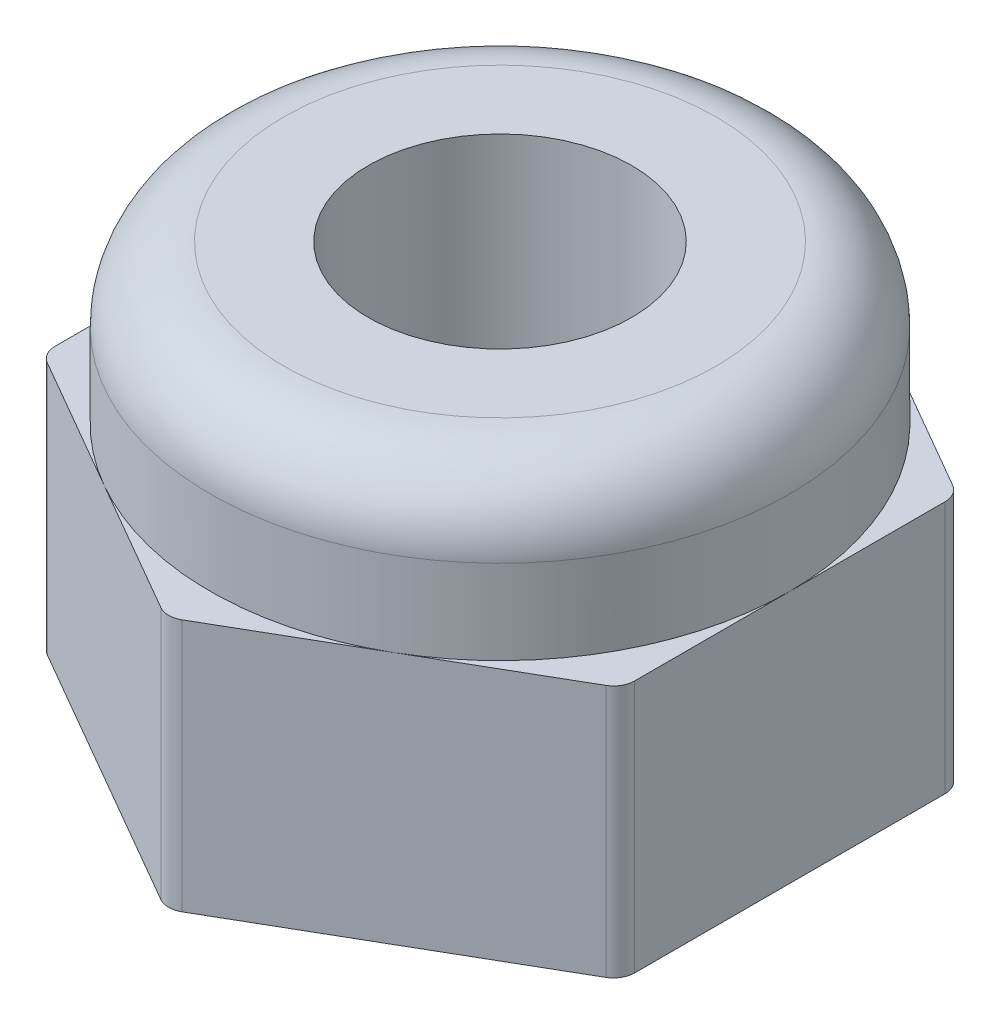
ISO-10303-21;
HEADER;
FILE_DESCRIPTION(('STEP AP214'),'2;1');
FILE_NAME('part.step','',(''),(''),'','','');
FILE_SCHEMA(('AUTOMOTIVE_DESIGN { 1 0 10303 214 1 1 1 1 }'));
ENDSEC;
DATA;
#1=APPLICATION_CONTEXT('core data for automotive mechanical design processes');
#2=APPLICATION_PROTOCOL_DEFINITION('international standard','automotive_design',2000,#1);
#3=PRODUCT_CONTEXT('',#1,'mechanical');
#4=PRODUCT('Part','Part','',(#3));
#5=PRODUCT_RELATED_PRODUCT_CATEGORY('part','',(#4));
#6=PRODUCT_DEFINITION_FORMATION('','',#4);
#7=PRODUCT_DEFINITION_CONTEXT('part definition',#1,'design');
#8=PRODUCT_DEFINITION('design','',#6,#7);
#9=PRODUCT_DEFINITION_SHAPE('','',#8);
#10=(LENGTH_UNIT() NAMED_UNIT(*) SI_UNIT(.MILLI.,.METRE.));
#11=(NAMED_UNIT(*) PLANE_ANGLE_UNIT() SI_UNIT($,.RADIAN.));
#12=(NAMED_UNIT(*) SI_UNIT($,.STERADIAN.) SOLID_ANGLE_UNIT());
#13=UNCERTAINTY_MEASURE_WITH_UNIT(LENGTH_MEASURE(1.E-05),#10,'distance_accuracy_value','');
#14=(GEOMETRIC_REPRESENTATION_CONTEXT(3) GLOBAL_UNCERTAINTY_ASSIGNED_CONTEXT((#13)) GLOBAL_UNIT_ASSIGNED_CONTEXT((#10,
#11,#12)) REPRESENTATION_CONTEXT('',''));
#15=CARTESIAN_POINT('',(0.,0.,0.));
#16=DIRECTION('',(0.,0.,1.));
#17=DIRECTION('',(1.,0.,0.));
#18=AXIS2_PLACEMENT_3D('',#15,#16,#17);
#19=CARTESIAN_POINT('',(0.,2.4,0.));
#20=DIRECTION('',(0.,1.,0.));
#21=DIRECTION('',(0.,0.,1.));
#22=AXIS2_PLACEMENT_3D('',#19,#20,#21);
#23=PLANE('',#22);
#24=DIRECTION('',(0.866025403784439,0.,-0.5));
#25=VECTOR('',#24,1.);
#26=CARTESIAN_POINT('',(0.,2.4,3.17542648054294));
#27=LINE('',#26,#25);
#28=CARTESIAN_POINT('',(1.375,2.4,2.38156986040721));
#29=VERTEX_POINT('',#28);
#30=CARTESIAN_POINT('',(2.65,2.4,1.64544826719043));
#31=VERTEX_POINT('',#30);
#32=EDGE_CURVE('E160',#29,#31,#27,.T.);
#33=ORIENTED_EDGE('',*,*,#32,.T.);
#34=CARTESIAN_POINT('',(2.55,2.4,1.47224318643355));
#35=DIRECTION('',(0.,1.,0.));
#36=DIRECTION('',(0.,0.,1.));
#37=AXIS2_PLACEMENT_3D('',#34,#35,#36);
#38=CIRCLE('',#37,0.2);
#39=CARTESIAN_POINT('',(2.75,2.4,1.47224318643355));
#40=VERTEX_POINT('',#39);
#41=EDGE_CURVE('E53',#31,#40,#38,.T.);
#42=ORIENTED_EDGE('',*,*,#41,.T.);
#43=DIRECTION('',(0.,0.,-1.));
#44=VECTOR('',#43,1.);
#45=CARTESIAN_POINT('',(2.75,2.4,1.58771324027147));
#46=LINE('',#45,#44);
#47=CARTESIAN_POINT('',(2.75,2.4,0.));
#48=VERTEX_POINT('',#47);
#49=EDGE_CURVE('E171',#40,#48,#46,.T.);
#50=ORIENTED_EDGE('',*,*,#49,.T.);
#51=CARTESIAN_POINT('',(0.,2.4,0.));
#52=DIRECTION('',(0.,1.,0.));
#53=DIRECTION('',(0.,0.,1.));
#54=AXIS2_PLACEMENT_3D('',#51,#52,#53);
#55=CIRCLE('',#54,2.75);
#56=EDGE_CURVE('E169',#29,#48,#55,.T.);
#57=ORIENTED_EDGE('',*,*,#56,.F.);
#58=EDGE_LOOP('',(#33,#42,#50,#57));
#59=FACE_BOUND('',#58,.T.);
#60=ADVANCED_FACE('F43',(#59),#23,.T.);
#61=CARTESIAN_POINT('',(2.75,2.4,-1.47224318643355));
#62=VERTEX_POINT('',#61);
#63=EDGE_CURVE('E195',#48,#62,#46,.T.);
#64=ORIENTED_EDGE('',*,*,#63,.T.);
#65=CARTESIAN_POINT('',(2.55,2.4,-1.47224318643355));
#66=DIRECTION('',(0.,1.,0.));
#67=DIRECTION('',(0.,0.,1.));
#68=AXIS2_PLACEMENT_3D('',#65,#66,#67);
#69=CIRCLE('',#68,0.2);
#70=CARTESIAN_POINT('',(2.65,2.4,-1.64544826719043));
#71=VERTEX_POINT('',#70);
#72=EDGE_CURVE('E301',#62,#71,#69,.T.);
#73=ORIENTED_EDGE('',*,*,#72,.T.);
#74=DIRECTION('',(-0.866025403784438,0.,-0.5));
#75=VECTOR('',#74,1.);
#76=CARTESIAN_POINT('',(2.75,2.4,-1.58771324027147));
#77=LINE('',#76,#75);
#78=CARTESIAN_POINT('',(1.375,2.4,-2.38156986040721));
#79=VERTEX_POINT('',#78);
#80=EDGE_CURVE('E196',#71,#79,#77,.T.);
#81=ORIENTED_EDGE('',*,*,#80,.T.);
#82=EDGE_CURVE('E177',#48,#79,#55,.T.);
#83=ORIENTED_EDGE('',*,*,#82,.F.);
#84=EDGE_LOOP('',(#64,#73,#81,#83));
#85=FACE_BOUND('',#84,.T.);
#86=ADVANCED_FACE('F366',(#85),#23,.T.);
#87=CARTESIAN_POINT('',(0.100000000000001,2.4,-3.11769145362398));
#88=VERTEX_POINT('',#87);
#89=EDGE_CURVE('E194',#79,#88,#77,.T.);
#90=ORIENTED_EDGE('',*,*,#89,.T.);
#91=CARTESIAN_POINT('',(0.,2.4,-2.94448637286709));
#92=DIRECTION('',(0.,1.,0.));
#93=DIRECTION('',(0.,0.,1.));
#94=AXIS2_PLACEMENT_3D('',#91,#92,#93);
#95=CIRCLE('',#94,0.2);
#96=CARTESIAN_POINT('',(-0.0999999999999998,2.4,-3.11769145362398));
#97=VERTEX_POINT('',#96);
#98=EDGE_CURVE('E291',#88,#97,#95,.T.);
#99=ORIENTED_EDGE('',*,*,#98,.T.);
#100=DIRECTION('',(-0.866025403784439,0.,0.5));
#101=VECTOR('',#100,1.);
#102=CARTESIAN_POINT('',(0.,2.4,-3.17542648054294));
#103=LINE('',#102,#101);
#104=CARTESIAN_POINT('',(-1.375,2.4,-2.38156986040721));
#105=VERTEX_POINT('',#104);
#106=EDGE_CURVE('E200',#97,#105,#103,.T.);
#107=ORIENTED_EDGE('',*,*,#106,.T.);
#108=EDGE_CURVE('E371',#79,#105,#55,.T.);
#109=ORIENTED_EDGE('',*,*,#108,.F.);
#110=EDGE_LOOP('',(#90,#99,#107,#109));
#111=FACE_BOUND('',#110,.T.);
#112=ADVANCED_FACE('F381',(#111),#23,.T.);
#113=CARTESIAN_POINT('',(-2.65,2.4,-1.64544826719043));
#114=VERTEX_POINT('',#113);
#115=EDGE_CURVE('E199',#105,#114,#103,.T.);
#116=ORIENTED_EDGE('',*,*,#115,.T.);
#117=CARTESIAN_POINT('',(-2.55,2.4,-1.47224318643355));
#118=DIRECTION('',(0.,1.,0.));
#119=DIRECTION('',(0.,0.,1.));
#120=AXIS2_PLACEMENT_3D('',#117,#118,#119);
#121=CIRCLE('',#120,0.2);
#122=CARTESIAN_POINT('',(-2.75,2.4,-1.47224318643355));
#123=VERTEX_POINT('',#122);
#124=EDGE_CURVE('E281',#114,#123,#121,.T.);
#125=ORIENTED_EDGE('',*,*,#124,.T.);
#126=DIRECTION('',(0.,0.,1.));
#127=VECTOR('',#126,1.);
#128=CARTESIAN_POINT('',(-2.75,2.4,-1.58771324027147));
#129=LINE('',#128,#127);
#130=CARTESIAN_POINT('',(-2.75,2.4,0.));
#131=VERTEX_POINT('',#130);
#132=EDGE_CURVE('E204',#123,#131,#129,.T.);
#133=ORIENTED_EDGE('',*,*,#132,.T.);
#134=EDGE_CURVE('E187',#105,#131,#55,.T.);
#135=ORIENTED_EDGE('',*,*,#134,.F.);
#136=EDGE_LOOP('',(#116,#125,#133,#135));
#137=FACE_BOUND('',#136,.T.);
#138=ADVANCED_FACE('F377',(#137),#23,.T.);
#139=CARTESIAN_POINT('',(-2.75,2.4,1.47224318643355));
#140=VERTEX_POINT('',#139);
#141=EDGE_CURVE('E203',#131,#140,#129,.T.);
#142=ORIENTED_EDGE('',*,*,#141,.T.);
#143=CARTESIAN_POINT('',(-2.55,2.4,1.47224318643355));
#144=DIRECTION('',(0.,1.,0.));
#145=DIRECTION('',(0.,0.,1.));
#146=AXIS2_PLACEMENT_3D('',#143,#144,#145);
#147=CIRCLE('',#146,0.2);
#148=CARTESIAN_POINT('',(-2.65,2.4,1.64544826719043));
#149=VERTEX_POINT('',#148);
#150=EDGE_CURVE('E271',#140,#149,#147,.T.);
#151=ORIENTED_EDGE('',*,*,#150,.T.);
#152=DIRECTION('',(0.866025403784439,0.,0.5));
#153=VECTOR('',#152,1.);
#154=CARTESIAN_POINT('',(-2.75,2.4,1.58771324027147));
#155=LINE('',#154,#153);
#156=CARTESIAN_POINT('',(-1.375,2.4,2.38156986040721));
#157=VERTEX_POINT('',#156);
#158=EDGE_CURVE('E167',#149,#157,#155,.T.);
#159=ORIENTED_EDGE('',*,*,#158,.T.);
#160=EDGE_CURVE('E183',#131,#157,#55,.T.);
#161=ORIENTED_EDGE('',*,*,#160,.F.);
#162=EDGE_LOOP('',(#142,#151,#159,#161));
#163=FACE_BOUND('',#162,.T.);
#164=ADVANCED_FACE('F388',(#163),#23,.T.);
#165=CARTESIAN_POINT('',(2.75,2.4,1.58771324027147));
#166=DIRECTION('',(-1.,0.,0.));
#167=DIRECTION('',(0.,0.,1.));
#168=AXIS2_PLACEMENT_3D('',#165,#166,#167);
#169=PLANE('',#168);
#170=DIRECTION('',(0.,0.,-1.));
#171=VECTOR('',#170,1.);
#172=CARTESIAN_POINT('',(2.75,0.,1.58771324027147));
#173=LINE('',#172,#171);
#174=CARTESIAN_POINT('',(2.75,0.,1.47224318643355));
#175=VERTEX_POINT('',#174);
#176=CARTESIAN_POINT('',(2.75,0.,-1.47224318643355));
#177=VERTEX_POINT('',#176);
#178=EDGE_CURVE('E176',#175,#177,#173,.T.);
#179=ORIENTED_EDGE('',*,*,#178,.T.);
#180=DIRECTION('',(0.,-1.,0.));
#181=VECTOR('',#180,1.);
#182=CARTESIAN_POINT('',(2.75,2.4,-1.47224318643355));
#183=LINE('',#182,#181);
#184=EDGE_CURVE('E298',#177,#62,#183,.F.);
#185=ORIENTED_EDGE('',*,*,#184,.T.);
#186=ORIENTED_EDGE('',*,*,#63,.F.);
#187=ORIENTED_EDGE('',*,*,#49,.F.);
#188=DIRECTION('',(0.,-1.,0.));
#189=VECTOR('',#188,1.);
#190=CARTESIAN_POINT('',(2.75,2.4,1.47224318643355));
#191=LINE('',#190,#189);
#192=EDGE_CURVE('E294',#40,#175,#191,.T.);
#193=ORIENTED_EDGE('',*,*,#192,.T.);
#194=EDGE_LOOP('',(#179,#185,#186,#187,#193));
#195=FACE_BOUND('',#194,.T.);
#196=ADVANCED_FACE('F314',(#195),#169,.F.);
#197=CARTESIAN_POINT('',(2.75,2.4,-1.58771324027147));
#198=DIRECTION('',(-0.5,0.,0.866025403784439));
#199=DIRECTION('',(0.866025403784439,0.,0.5));
#200=AXIS2_PLACEMENT_3D('',#197,#198,#199);
#201=PLANE('',#200);
#202=DIRECTION('',(-0.866025403784438,0.,-0.5));
#203=VECTOR('',#202,1.);
#204=CARTESIAN_POINT('',(2.75,0.,-1.58771324027147));
#205=LINE('',#204,#203);
#206=CARTESIAN_POINT('',(2.65,0.,-1.64544826719043));
#207=VERTEX_POINT('',#206);
#208=CARTESIAN_POINT('',(0.100000000000001,0.,-3.11769145362398));
#209=VERTEX_POINT('',#208);
#210=EDGE_CURVE('E213',#207,#209,#205,.T.);
#211=ORIENTED_EDGE('',*,*,#210,.T.);
#212=DIRECTION('',(0.,-1.,0.));
#213=VECTOR('',#212,1.);
#214=CARTESIAN_POINT('',(0.0999999999999998,2.4,-3.11769145362398));
#215=LINE('',#214,#213);
#216=EDGE_CURVE('E288',#209,#88,#215,.F.);
#217=ORIENTED_EDGE('',*,*,#216,.T.);
#218=ORIENTED_EDGE('',*,*,#89,.F.);
#219=ORIENTED_EDGE('',*,*,#80,.F.);
#220=DIRECTION('',(0.,-1.,0.));
#221=VECTOR('',#220,1.);
#222=CARTESIAN_POINT('',(2.65,2.4,-1.64544826719043));
#223=LINE('',#222,#221);
#224=EDGE_CURVE('E284',#71,#207,#223,.T.);
#225=ORIENTED_EDGE('',*,*,#224,.T.);
#226=EDGE_LOOP('',(#211,#217,#218,#219,#225));
#227=FACE_BOUND('',#226,.T.);
#228=ADVANCED_FACE('F356',(#227),#201,.F.);
#229=CARTESIAN_POINT('',(0.,2.4,-3.17542648054294));
#230=DIRECTION('',(0.5,0.,0.866025403784439));
#231=DIRECTION('',(0.866025403784439,0.,-0.5));
#232=AXIS2_PLACEMENT_3D('',#229,#230,#231);
#233=PLANE('',#232);
#234=DIRECTION('',(-0.866025403784439,0.,0.5));
#235=VECTOR('',#234,1.);
#236=CARTESIAN_POINT('',(0.,0.,-3.17542648054294));
#237=LINE('',#236,#235);
#238=CARTESIAN_POINT('',(-0.0999999999999998,0.,-3.11769145362398));
#239=VERTEX_POINT('',#238);
#240=CARTESIAN_POINT('',(-2.65,0.,-1.64544826719043));
#241=VERTEX_POINT('',#240);
#242=EDGE_CURVE('E217',#239,#241,#237,.T.);
#243=ORIENTED_EDGE('',*,*,#242,.T.);
#244=DIRECTION('',(0.,-1.,0.));
#245=VECTOR('',#244,1.);
#246=CARTESIAN_POINT('',(-2.65,2.4,-1.64544826719044));
#247=LINE('',#246,#245);
#248=EDGE_CURVE('E278',#241,#114,#247,.F.);
#249=ORIENTED_EDGE('',*,*,#248,.T.);
#250=ORIENTED_EDGE('',*,*,#115,.F.);
#251=ORIENTED_EDGE('',*,*,#106,.F.);
#252=DIRECTION('',(0.,-1.,0.));
#253=VECTOR('',#252,1.);
#254=CARTESIAN_POINT('',(-0.0999999999999998,2.4,-3.11769145362398));
#255=LINE('',#254,#253);
#256=EDGE_CURVE('E274',#97,#239,#255,.T.);
#257=ORIENTED_EDGE('',*,*,#256,.T.);
#258=EDGE_LOOP('',(#243,#249,#250,#251,#257));
#259=FACE_BOUND('',#258,.T.);
#260=ADVANCED_FACE('F345',(#259),#233,.F.);
#261=CARTESIAN_POINT('',(-2.75,2.4,-1.58771324027147));
#262=DIRECTION('',(1.,0.,0.));
#263=DIRECTION('',(0.,0.,-1.));
#264=AXIS2_PLACEMENT_3D('',#261,#262,#263);
#265=PLANE('',#264);
#266=DIRECTION('',(0.,0.,1.));
#267=VECTOR('',#266,1.);
#268=CARTESIAN_POINT('',(-2.75,0.,-1.58771324027147));
#269=LINE('',#268,#267);
#270=CARTESIAN_POINT('',(-2.75,0.,-1.47224318643355));
#271=VERTEX_POINT('',#270);
#272=CARTESIAN_POINT('',(-2.75,0.,1.47224318643355));
#273=VERTEX_POINT('',#272);
#274=EDGE_CURVE('E221',#271,#273,#269,.T.);
#275=ORIENTED_EDGE('',*,*,#274,.T.);
#276=DIRECTION('',(0.,-1.,0.));
#277=VECTOR('',#276,1.);
#278=CARTESIAN_POINT('',(-2.75,2.4,1.47224318643355));
#279=LINE('',#278,#277);
#280=EDGE_CURVE('E268',#273,#140,#279,.F.);
#281=ORIENTED_EDGE('',*,*,#280,.T.);
#282=ORIENTED_EDGE('',*,*,#141,.F.);
#283=ORIENTED_EDGE('',*,*,#132,.F.);
#284=DIRECTION('',(0.,-1.,0.));
#285=VECTOR('',#284,1.);
#286=CARTESIAN_POINT('',(-2.75,2.4,-1.47224318643355));
#287=LINE('',#286,#285);
#288=EDGE_CURVE('E264',#123,#271,#287,.T.);
#289=ORIENTED_EDGE('',*,*,#288,.T.);
#290=EDGE_LOOP('',(#275,#281,#282,#283,#289));
#291=FACE_BOUND('',#290,.T.);
#292=ADVANCED_FACE('F334',(#291),#265,.F.);
#293=CARTESIAN_POINT('',(-2.75,2.4,1.58771324027147));
#294=DIRECTION('',(0.5,0.,-0.866025403784439));
#295=DIRECTION('',(-0.866025403784439,0.,-0.5));
#296=AXIS2_PLACEMENT_3D('',#293,#294,#295);
#297=PLANE('',#296);
#298=ORIENTED_EDGE('',*,*,#158,.F.);
#299=DIRECTION('',(0.,-1.,0.));
#300=VECTOR('',#299,1.);
#301=CARTESIAN_POINT('',(-2.65,2.4,1.64544826719043));
#302=LINE('',#301,#300);
#303=CARTESIAN_POINT('',(-2.65,0.,1.64544826719043));
#304=VERTEX_POINT('',#303);
#305=EDGE_CURVE('E242',#149,#304,#302,.T.);
#306=ORIENTED_EDGE('',*,*,#305,.T.);
#307=DIRECTION('',(0.866025403784439,0.,0.5));
#308=VECTOR('',#307,1.);
#309=CARTESIAN_POINT('',(-2.75,0.,1.58771324027147));
#310=LINE('',#309,#308);
#311=CARTESIAN_POINT('',(-0.099999999999999,0.,3.11769145362398));
#312=VERTEX_POINT('',#311);
#313=EDGE_CURVE('E225',#304,#312,#310,.T.);
#314=ORIENTED_EDGE('',*,*,#313,.T.);
#315=DIRECTION('',(0.,-1.,0.));
#316=VECTOR('',#315,1.);
#317=CARTESIAN_POINT('',(-0.099999999999999,2.4,3.11769145362398));
#318=LINE('',#317,#316);
#319=CARTESIAN_POINT('',(-0.099999999999999,2.4,3.11769145362398));
#320=VERTEX_POINT('',#319);
#321=EDGE_CURVE('E239',#312,#320,#318,.F.);
#322=ORIENTED_EDGE('',*,*,#321,.T.);
#323=EDGE_CURVE('E207',#157,#320,#155,.T.);
#324=ORIENTED_EDGE('',*,*,#323,.F.);
#325=EDGE_LOOP('',(#298,#306,#314,#322,#324));
#326=FACE_BOUND('',#325,.T.);
#327=ADVANCED_FACE('F326',(#326),#297,.F.);
#328=CARTESIAN_POINT('',(0.,2.4,3.17542648054294));
#329=DIRECTION('',(-0.5,0.,-0.866025403784439));
#330=DIRECTION('',(-0.866025403784439,0.,0.5));
#331=AXIS2_PLACEMENT_3D('',#328,#329,#330);
#332=PLANE('',#331);
#333=DIRECTION('',(0.866025403784439,0.,-0.5));
#334=VECTOR('',#333,1.);
#335=CARTESIAN_POINT('',(0.,0.,3.17542648054294));
#336=LINE('',#335,#334);
#337=CARTESIAN_POINT('',(0.100000000000001,0.,3.11769145362398));
#338=VERTEX_POINT('',#337);
#339=CARTESIAN_POINT('',(2.65,0.,1.64544826719043));
#340=VERTEX_POINT('',#339);
#341=EDGE_CURVE('E229',#338,#340,#336,.T.);
#342=ORIENTED_EDGE('',*,*,#341,.T.);
#343=DIRECTION('',(0.,-1.,0.));
#344=VECTOR('',#343,1.);
#345=CARTESIAN_POINT('',(2.65,2.4,1.64544826719043));
#346=LINE('',#345,#344);
#347=EDGE_CURVE('E66',#340,#31,#346,.F.);
#348=ORIENTED_EDGE('',*,*,#347,.T.);
#349=ORIENTED_EDGE('',*,*,#32,.F.);
#350=CARTESIAN_POINT('',(0.100000000000001,2.4,3.11769145362398));
#351=VERTEX_POINT('',#350);
#352=EDGE_CURVE('E151',#351,#29,#27,.T.);
#353=ORIENTED_EDGE('',*,*,#352,.F.);
#354=DIRECTION('',(0.,-1.,0.));
#355=VECTOR('',#354,1.);
#356=CARTESIAN_POINT('',(0.100000000000001,2.4,3.11769145362398));
#357=LINE('',#356,#355);
#358=EDGE_CURVE('E304',#351,#338,#357,.T.);
#359=ORIENTED_EDGE('',*,*,#358,.T.);
#360=EDGE_LOOP('',(#342,#348,#349,#353,#359));
#361=FACE_BOUND('',#360,.T.);
#362=ADVANCED_FACE('F163',(#361),#332,.F.);
#363=ORIENTED_EDGE('',*,*,#323,.T.);
#364=CARTESIAN_POINT('',(0.,2.4,2.94448637286709));
#365=DIRECTION('',(0.,1.,0.));
#366=DIRECTION('',(0.,0.,1.));
#367=AXIS2_PLACEMENT_3D('',#364,#365,#366);
#368=CIRCLE('',#367,0.2);
#369=EDGE_CURVE('E11',#320,#351,#368,.T.);
#370=ORIENTED_EDGE('',*,*,#369,.T.);
#371=ORIENTED_EDGE('',*,*,#352,.T.);
#372=EDGE_CURVE('E154',#157,#29,#55,.T.);
#373=ORIENTED_EDGE('',*,*,#372,.F.);
#374=EDGE_LOOP('',(#363,#370,#371,#373));
#375=FACE_BOUND('',#374,.T.);
#376=ADVANCED_FACE('F152',(#375),#23,.T.);
#377=CARTESIAN_POINT('',(0.,0.,0.));
#378=DIRECTION('',(0.,1.,0.));
#379=DIRECTION('',(0.,0.,1.));
#380=AXIS2_PLACEMENT_3D('',#377,#378,#379);
#381=PLANE('',#380);
#382=CARTESIAN_POINT('',(0.,0.,0.));
#383=DIRECTION('',(0.,-1.,0.));
#384=DIRECTION('',(0.,0.,-1.));
#385=AXIS2_PLACEMENT_3D('',#382,#383,#384);
#386=CIRCLE('',#385,1.25);
#387=CARTESIAN_POINT('',(0.,0.,-1.25));
#388=VERTEX_POINT('',#387);
#389=EDGE_CURVE('E189',#388,#388,#386,.T.);
#390=ORIENTED_EDGE('',*,*,#389,.F.);
#391=EDGE_LOOP('',(#390));
#392=FACE_BOUND('',#391,.T.);
#393=ORIENTED_EDGE('',*,*,#313,.F.);
#394=CARTESIAN_POINT('',(-2.55,0.,1.47224318643355));
#395=DIRECTION('',(0.,1.,0.));
#396=DIRECTION('',(0.,0.,1.));
#397=AXIS2_PLACEMENT_3D('',#394,#395,#396);
#398=CIRCLE('',#397,0.2);
#399=EDGE_CURVE('E261',#304,#273,#398,.F.);
#400=ORIENTED_EDGE('',*,*,#399,.T.);
#401=ORIENTED_EDGE('',*,*,#274,.F.);
#402=CARTESIAN_POINT('',(-2.55,0.,-1.47224318643355));
#403=DIRECTION('',(0.,1.,0.));
#404=DIRECTION('',(0.,0.,1.));
#405=AXIS2_PLACEMENT_3D('',#402,#403,#404);
#406=CIRCLE('',#405,0.2);
#407=EDGE_CURVE('E258',#271,#241,#406,.F.);
#408=ORIENTED_EDGE('',*,*,#407,.T.);
#409=ORIENTED_EDGE('',*,*,#242,.F.);
#410=CARTESIAN_POINT('',(0.,0.,-2.94448637286709));
#411=DIRECTION('',(0.,1.,0.));
#412=DIRECTION('',(0.,0.,1.));
#413=AXIS2_PLACEMENT_3D('',#410,#411,#412);
#414=CIRCLE('',#413,0.2);
#415=EDGE_CURVE('E255',#239,#209,#414,.F.);
#416=ORIENTED_EDGE('',*,*,#415,.T.);
#417=ORIENTED_EDGE('',*,*,#210,.F.);
#418=CARTESIAN_POINT('',(2.55,0.,-1.47224318643355));
#419=DIRECTION('',(0.,1.,0.));
#420=DIRECTION('',(0.,0.,1.));
#421=AXIS2_PLACEMENT_3D('',#418,#419,#420);
#422=CIRCLE('',#421,0.2);
#423=EDGE_CURVE('E252',#207,#177,#422,.F.);
#424=ORIENTED_EDGE('',*,*,#423,.T.);
#425=ORIENTED_EDGE('',*,*,#178,.F.);
#426=CARTESIAN_POINT('',(2.55,0.,1.47224318643355));
#427=DIRECTION('',(0.,1.,0.));
#428=DIRECTION('',(0.,0.,1.));
#429=AXIS2_PLACEMENT_3D('',#426,#427,#428);
#430=CIRCLE('',#429,0.2);
#431=EDGE_CURVE('E249',#175,#340,#430,.F.);
#432=ORIENTED_EDGE('',*,*,#431,.T.);
#433=ORIENTED_EDGE('',*,*,#341,.F.);
#434=CARTESIAN_POINT('',(0.,0.,2.94448637286709));
#435=DIRECTION('',(0.,1.,0.));
#436=DIRECTION('',(0.,0.,1.));
#437=AXIS2_PLACEMENT_3D('',#434,#435,#436);
#438=CIRCLE('',#437,0.2);
#439=EDGE_CURVE('E246',#338,#312,#438,.F.);
#440=ORIENTED_EDGE('',*,*,#439,.T.);
#441=EDGE_LOOP('',(#393,#400,#401,#408,#409,#416,#417,#424,#425,#432,#433,#440));
#442=FACE_BOUND('',#441,.T.);
#443=ADVANCED_FACE('F321',(#392,#442),#381,.F.);
#444=CARTESIAN_POINT('',(0.,3.9,0.));
#445=DIRECTION('',(0.,-1.,0.));
#446=DIRECTION('',(0.,0.,-1.));
#447=AXIS2_PLACEMENT_3D('',#444,#445,#446);
#448=CYLINDRICAL_SURFACE('',#447,2.75);
#449=CARTESIAN_POINT('',(0.,3.2,0.));
#450=DIRECTION('',(0.,-1.,0.));
#451=DIRECTION('',(0.,0.,-1.));
#452=AXIS2_PLACEMENT_3D('',#449,#450,#451);
#453=CIRCLE('',#452,2.75);
#454=CARTESIAN_POINT('',(0.,3.2,-2.75));
#455=VERTEX_POINT('',#454);
#456=EDGE_CURVE('E159',#455,#455,#453,.T.);
#457=ORIENTED_EDGE('',*,*,#456,.T.);
#458=EDGE_LOOP('',(#457));
#459=FACE_BOUND('',#458,.T.);
#460=ORIENTED_EDGE('',*,*,#372,.T.);
#461=ORIENTED_EDGE('',*,*,#56,.T.);
#462=ORIENTED_EDGE('',*,*,#82,.T.);
#463=ORIENTED_EDGE('',*,*,#108,.T.);
#464=ORIENTED_EDGE('',*,*,#134,.T.);
#465=ORIENTED_EDGE('',*,*,#160,.T.);
#466=EDGE_LOOP('',(#460,#461,#462,#463,#464,#465));
#467=FACE_BOUND('',#466,.T.);
#468=ADVANCED_FACE('F180',(#459,#467),#448,.T.);
#469=CARTESIAN_POINT('',(0.,3.9,0.));
#470=DIRECTION('',(0.,-1.,0.));
#471=DIRECTION('',(0.,0.,-1.));
#472=AXIS2_PLACEMENT_3D('',#469,#470,#471);
#473=PLANE('',#472);
#474=CARTESIAN_POINT('',(0.,3.9,0.));
#475=DIRECTION('',(0.,-1.,0.));
#476=DIRECTION('',(0.,0.,-1.));
#477=AXIS2_PLACEMENT_3D('',#474,#475,#476);
#478=CIRCLE('',#477,1.25);
#479=CARTESIAN_POINT('',(0.,3.9,-1.25));
#480=VERTEX_POINT('',#479);
#481=EDGE_CURVE('E47',#480,#480,#478,.T.);
#482=ORIENTED_EDGE('',*,*,#481,.T.);
#483=EDGE_LOOP('',(#482));
#484=FACE_BOUND('',#483,.T.);
#485=CARTESIAN_POINT('',(0.,3.9,0.));
#486=DIRECTION('',(0.,-1.,0.));
#487=DIRECTION('',(0.,0.,-1.));
#488=AXIS2_PLACEMENT_3D('',#485,#486,#487);
#489=CIRCLE('',#488,2.05);
#490=CARTESIAN_POINT('',(0.,3.9,-2.05));
#491=VERTEX_POINT('',#490);
#492=EDGE_CURVE('E235',#491,#491,#489,.F.);
#493=ORIENTED_EDGE('',*,*,#492,.T.);
#494=EDGE_LOOP('',(#493));
#495=FACE_BOUND('',#494,.T.);
#496=ADVANCED_FACE('F417',(#484,#495),#473,.F.);
#497=CARTESIAN_POINT('',(0.,3.2,0.));
#498=DIRECTION('',(0.,-1.,0.));
#499=DIRECTION('',(0.,0.,-1.));
#500=AXIS2_PLACEMENT_3D('',#497,#498,#499);
#501=TOROIDAL_SURFACE('',#500,2.05,0.7);
#502=ORIENTED_EDGE('',*,*,#492,.F.);
#503=EDGE_LOOP('',(#502));
#504=FACE_BOUND('',#503,.T.);
#505=ORIENTED_EDGE('',*,*,#456,.F.);
#506=EDGE_LOOP('',(#505));
#507=FACE_BOUND('',#506,.T.);
#508=ADVANCED_FACE('F414',(#504,#507),#501,.T.);
#509=CARTESIAN_POINT('',(-2.55,2.4,1.47224318643355));
#510=DIRECTION('',(0.,-1.,0.));
#511=DIRECTION('',(0.,0.,-1.));
#512=AXIS2_PLACEMENT_3D('',#509,#510,#511);
#513=CYLINDRICAL_SURFACE('',#512,0.2);
#514=ORIENTED_EDGE('',*,*,#150,.F.);
#515=ORIENTED_EDGE('',*,*,#280,.F.);
#516=ORIENTED_EDGE('',*,*,#399,.F.);
#517=ORIENTED_EDGE('',*,*,#305,.F.);
#518=EDGE_LOOP('',(#514,#515,#516,#517));
#519=FACE_BOUND('',#518,.T.);
#520=ADVANCED_FACE('F330',(#519),#513,.T.);
#521=CARTESIAN_POINT('',(-2.55,2.4,-1.47224318643355));
#522=DIRECTION('',(0.,-1.,0.));
#523=DIRECTION('',(0.,0.,-1.));
#524=AXIS2_PLACEMENT_3D('',#521,#522,#523);
#525=CYLINDRICAL_SURFACE('',#524,0.2);
#526=ORIENTED_EDGE('',*,*,#124,.F.);
#527=ORIENTED_EDGE('',*,*,#248,.F.);
#528=ORIENTED_EDGE('',*,*,#407,.F.);
#529=ORIENTED_EDGE('',*,*,#288,.F.);
#530=EDGE_LOOP('',(#526,#527,#528,#529));
#531=FACE_BOUND('',#530,.T.);
#532=ADVANCED_FACE('F341',(#531),#525,.T.);
#533=CARTESIAN_POINT('',(0.,2.4,-2.94448637286709));
#534=DIRECTION('',(0.,-1.,0.));
#535=DIRECTION('',(0.,0.,-1.));
#536=AXIS2_PLACEMENT_3D('',#533,#534,#535);
#537=CYLINDRICAL_SURFACE('',#536,0.2);
#538=ORIENTED_EDGE('',*,*,#98,.F.);
#539=ORIENTED_EDGE('',*,*,#216,.F.);
#540=ORIENTED_EDGE('',*,*,#415,.F.);
#541=ORIENTED_EDGE('',*,*,#256,.F.);
#542=EDGE_LOOP('',(#538,#539,#540,#541));
#543=FACE_BOUND('',#542,.T.);
#544=ADVANCED_FACE('F352',(#543),#537,.T.);
#545=CARTESIAN_POINT('',(2.55,2.4,-1.47224318643355));
#546=DIRECTION('',(0.,-1.,0.));
#547=DIRECTION('',(0.,0.,-1.));
#548=AXIS2_PLACEMENT_3D('',#545,#546,#547);
#549=CYLINDRICAL_SURFACE('',#548,0.2);
#550=ORIENTED_EDGE('',*,*,#72,.F.);
#551=ORIENTED_EDGE('',*,*,#184,.F.);
#552=ORIENTED_EDGE('',*,*,#423,.F.);
#553=ORIENTED_EDGE('',*,*,#224,.F.);
#554=EDGE_LOOP('',(#550,#551,#552,#553));
#555=FACE_BOUND('',#554,.T.);
#556=ADVANCED_FACE('F363',(#555),#549,.T.);
#557=CARTESIAN_POINT('',(2.55,2.4,1.47224318643355));
#558=DIRECTION('',(0.,-1.,0.));
#559=DIRECTION('',(0.,0.,-1.));
#560=AXIS2_PLACEMENT_3D('',#557,#558,#559);
#561=CYLINDRICAL_SURFACE('',#560,0.2);
#562=ORIENTED_EDGE('',*,*,#41,.F.);
#563=ORIENTED_EDGE('',*,*,#347,.F.);
#564=ORIENTED_EDGE('',*,*,#431,.F.);
#565=ORIENTED_EDGE('',*,*,#192,.F.);
#566=EDGE_LOOP('',(#562,#563,#564,#565));
#567=FACE_BOUND('',#566,.T.);
#568=ADVANCED_FACE('F317',(#567),#561,.T.);
#569=CARTESIAN_POINT('',(0.,2.4,2.94448637286709));
#570=DIRECTION('',(0.,-1.,0.));
#571=DIRECTION('',(0.,0.,-1.));
#572=AXIS2_PLACEMENT_3D('',#569,#570,#571);
#573=CYLINDRICAL_SURFACE('',#572,0.2);
#574=ORIENTED_EDGE('',*,*,#369,.F.);
#575=ORIENTED_EDGE('',*,*,#321,.F.);
#576=ORIENTED_EDGE('',*,*,#439,.F.);
#577=ORIENTED_EDGE('',*,*,#358,.F.);
#578=EDGE_LOOP('',(#574,#575,#576,#577));
#579=FACE_BOUND('',#578,.T.);
#580=ADVANCED_FACE('F45',(#579),#573,.T.);
#581=CARTESIAN_POINT('',(0.,0.,0.));
#582=DIRECTION('',(0.,-1.,0.));
#583=DIRECTION('',(0.,0.,-1.));
#584=AXIS2_PLACEMENT_3D('',#581,#582,#583);
#585=CYLINDRICAL_SURFACE('',#584,1.25);
#586=ORIENTED_EDGE('',*,*,#389,.T.);
#587=EDGE_LOOP('',(#586));
#588=FACE_BOUND('',#587,.T.);
#589=ORIENTED_EDGE('',*,*,#481,.F.);
#590=EDGE_LOOP('',(#589));
#591=FACE_BOUND('',#590,.T.);
#592=ADVANCED_FACE('F430',(#588,#591),#585,.F.);
#593=CLOSED_SHELL('',(#60,#86,#112,#138,#164,#196,#228,#260,#292,#327,#362,#376,#443,#468,#496,
#508,#520,#532,#544,#556,#568,#580,#592));
#594=MANIFOLD_SOLID_BREP('B2',#593);
#595=ADVANCED_BREP_SHAPE_REPRESENTATION('',(#18,#594),#14);
#596=SHAPE_DEFINITION_REPRESENTATION(#9,#595);
ENDSEC;
END-ISO-10303-21;
